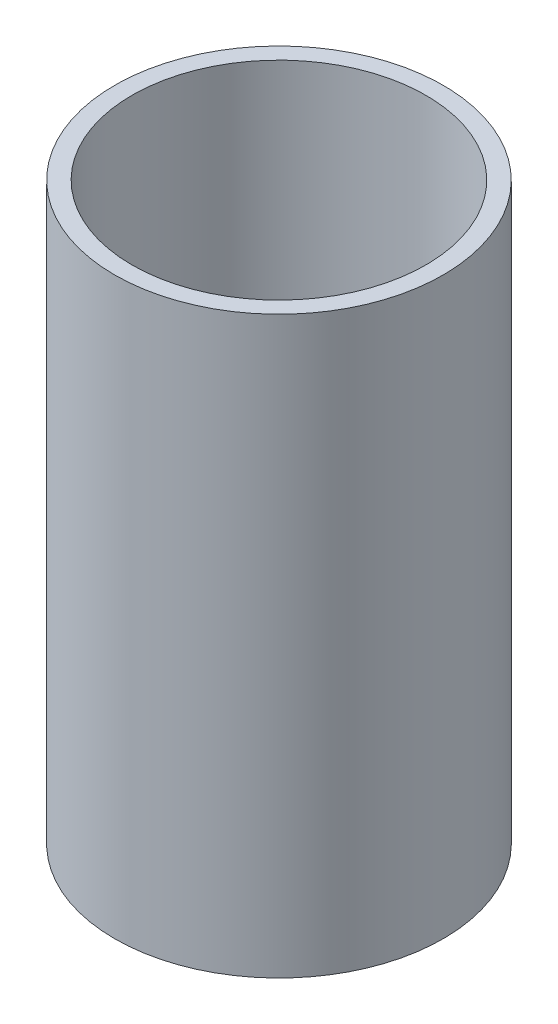
ISO-10303-21;
HEADER;
FILE_DESCRIPTION(('STEP AP214'),'2;1');
FILE_NAME('part.step','',(''),(''),'','','');
FILE_SCHEMA(('AUTOMOTIVE_DESIGN { 1 0 10303 214 1 1 1 1 }'));
ENDSEC;
DATA;
#1=APPLICATION_CONTEXT('core data for automotive mechanical design processes');
#2=APPLICATION_PROTOCOL_DEFINITION('international standard','automotive_design',2000,#1);
#3=PRODUCT_CONTEXT('',#1,'mechanical');
#4=PRODUCT('Part','Part','',(#3));
#5=PRODUCT_RELATED_PRODUCT_CATEGORY('part','',(#4));
#6=PRODUCT_DEFINITION_FORMATION('','',#4);
#7=PRODUCT_DEFINITION_CONTEXT('part definition',#1,'design');
#8=PRODUCT_DEFINITION('design','',#6,#7);
#9=PRODUCT_DEFINITION_SHAPE('','',#8);
#10=(LENGTH_UNIT() NAMED_UNIT(*) SI_UNIT(.MILLI.,.METRE.));
#11=(NAMED_UNIT(*) PLANE_ANGLE_UNIT() SI_UNIT($,.RADIAN.));
#12=(NAMED_UNIT(*) SI_UNIT($,.STERADIAN.) SOLID_ANGLE_UNIT());
#13=UNCERTAINTY_MEASURE_WITH_UNIT(LENGTH_MEASURE(1.E-05),#10,'distance_accuracy_value','');
#14=(GEOMETRIC_REPRESENTATION_CONTEXT(3) GLOBAL_UNCERTAINTY_ASSIGNED_CONTEXT((#13)) GLOBAL_UNIT_ASSIGNED_CONTEXT((#10,
#11,#12)) REPRESENTATION_CONTEXT('',''));
#15=CARTESIAN_POINT('',(0.,0.,0.));
#16=DIRECTION('',(0.,0.,1.));
#17=DIRECTION('',(1.,0.,0.));
#18=AXIS2_PLACEMENT_3D('',#15,#16,#17);
#19=CARTESIAN_POINT('',(0.,200.,0.));
#20=DIRECTION('',(0.,-1.,0.));
#21=DIRECTION('',(0.,0.,-1.));
#22=AXIS2_PLACEMENT_3D('',#19,#20,#21);
#23=CYLINDRICAL_SURFACE('',#22,51.1302);
#24=CARTESIAN_POINT('',(0.,200.,0.));
#25=DIRECTION('',(0.,1.,0.));
#26=DIRECTION('',(0.,0.,1.));
#27=AXIS2_PLACEMENT_3D('',#24,#25,#26);
#28=CIRCLE('',#27,51.1302);
#29=CARTESIAN_POINT('',(0.,200.,51.1302));
#30=VERTEX_POINT('',#29);
#31=EDGE_CURVE('E52',#30,#30,#28,.T.);
#32=ORIENTED_EDGE('',*,*,#31,.T.);
#33=EDGE_LOOP('',(#32));
#34=FACE_BOUND('',#33,.T.);
#35=CARTESIAN_POINT('',(0.,0.,0.));
#36=DIRECTION('',(0.,1.,0.));
#37=DIRECTION('',(0.,0.,1.));
#38=AXIS2_PLACEMENT_3D('',#35,#36,#37);
#39=CIRCLE('',#38,51.1302);
#40=CARTESIAN_POINT('',(0.,0.,51.1302));
#41=VERTEX_POINT('',#40);
#42=EDGE_CURVE('E59',#41,#41,#39,.T.);
#43=ORIENTED_EDGE('',*,*,#42,.F.);
#44=EDGE_LOOP('',(#43));
#45=FACE_BOUND('',#44,.T.);
#46=ADVANCED_FACE('F44',(#34,#45),#23,.F.);
#47=CARTESIAN_POINT('',(0.,200.,0.));
#48=DIRECTION('',(0.,-1.,0.));
#49=DIRECTION('',(0.,0.,-1.));
#50=AXIS2_PLACEMENT_3D('',#47,#48,#49);
#51=CYLINDRICAL_SURFACE('',#50,57.15);
#52=CARTESIAN_POINT('',(0.,200.,0.));
#53=DIRECTION('',(0.,1.,0.));
#54=DIRECTION('',(0.,0.,1.));
#55=AXIS2_PLACEMENT_3D('',#52,#53,#54);
#56=CIRCLE('',#55,57.15);
#57=CARTESIAN_POINT('',(0.,200.,57.15));
#58=VERTEX_POINT('',#57);
#59=EDGE_CURVE('E11',#58,#58,#56,.T.);
#60=ORIENTED_EDGE('',*,*,#59,.F.);
#61=EDGE_LOOP('',(#60));
#62=FACE_BOUND('',#61,.T.);
#63=CARTESIAN_POINT('',(0.,0.,0.));
#64=DIRECTION('',(0.,1.,0.));
#65=DIRECTION('',(0.,0.,1.));
#66=AXIS2_PLACEMENT_3D('',#63,#64,#65);
#67=CIRCLE('',#66,57.15);
#68=CARTESIAN_POINT('',(0.,0.,57.15));
#69=VERTEX_POINT('',#68);
#70=EDGE_CURVE('E47',#69,#69,#67,.T.);
#71=ORIENTED_EDGE('',*,*,#70,.T.);
#72=EDGE_LOOP('',(#71));
#73=FACE_BOUND('',#72,.T.);
#74=ADVANCED_FACE('F68',(#62,#73),#51,.T.);
#75=CARTESIAN_POINT('',(0.,200.,0.));
#76=DIRECTION('',(0.,1.,0.));
#77=DIRECTION('',(0.,0.,1.));
#78=AXIS2_PLACEMENT_3D('',#75,#76,#77);
#79=PLANE('',#78);
#80=ORIENTED_EDGE('',*,*,#31,.F.);
#81=EDGE_LOOP('',(#80));
#82=FACE_BOUND('',#81,.T.);
#83=ORIENTED_EDGE('',*,*,#59,.T.);
#84=EDGE_LOOP('',(#83));
#85=FACE_BOUND('',#84,.T.);
#86=ADVANCED_FACE('F72',(#82,#85),#79,.T.);
#87=CARTESIAN_POINT('',(0.,0.,0.));
#88=DIRECTION('',(0.,1.,0.));
#89=DIRECTION('',(0.,0.,1.));
#90=AXIS2_PLACEMENT_3D('',#87,#88,#89);
#91=PLANE('',#90);
#92=ORIENTED_EDGE('',*,*,#42,.T.);
#93=EDGE_LOOP('',(#92));
#94=FACE_BOUND('',#93,.T.);
#95=ORIENTED_EDGE('',*,*,#70,.F.);
#96=EDGE_LOOP('',(#95));
#97=FACE_BOUND('',#96,.T.);
#98=ADVANCED_FACE('F70',(#94,#97),#91,.F.);
#99=CLOSED_SHELL('',(#46,#74,#86,#98));
#100=MANIFOLD_SOLID_BREP('B2',#99);
#101=ADVANCED_BREP_SHAPE_REPRESENTATION('',(#18,#100),#14);
#102=SHAPE_DEFINITION_REPRESENTATION(#9,#101);
ENDSEC;
END-ISO-10303-21;
